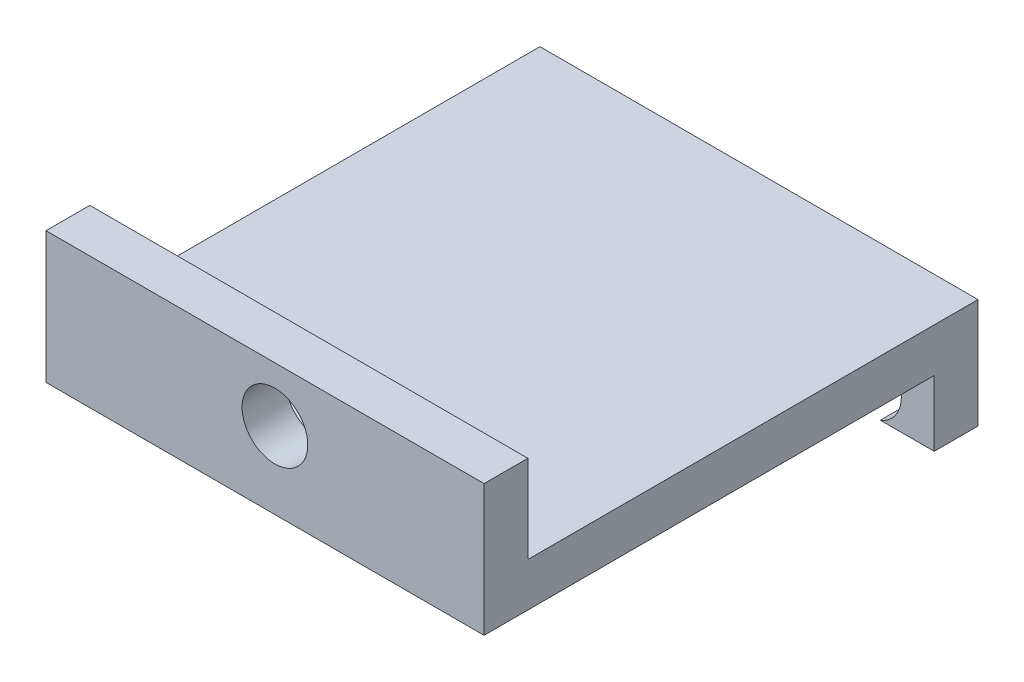
ISO-10303-21;
HEADER;
FILE_DESCRIPTION(('STEP AP214'),'2;1');
FILE_NAME('part.step','',(''),(''),'','','');
FILE_SCHEMA(('AUTOMOTIVE_DESIGN { 1 0 10303 214 1 1 1 1 }'));
ENDSEC;
DATA;
#1=APPLICATION_CONTEXT('core data for automotive mechanical design processes');
#2=APPLICATION_PROTOCOL_DEFINITION('international standard','automotive_design',2000,#1);
#3=PRODUCT_CONTEXT('',#1,'mechanical');
#4=PRODUCT('Part','Part','',(#3));
#5=PRODUCT_RELATED_PRODUCT_CATEGORY('part','',(#4));
#6=PRODUCT_DEFINITION_FORMATION('','',#4);
#7=PRODUCT_DEFINITION_CONTEXT('part definition',#1,'design');
#8=PRODUCT_DEFINITION('design','',#6,#7);
#9=PRODUCT_DEFINITION_SHAPE('','',#8);
#10=(LENGTH_UNIT() NAMED_UNIT(*) SI_UNIT(.MILLI.,.METRE.));
#11=(NAMED_UNIT(*) PLANE_ANGLE_UNIT() SI_UNIT($,.RADIAN.));
#12=(NAMED_UNIT(*) SI_UNIT($,.STERADIAN.) SOLID_ANGLE_UNIT());
#13=UNCERTAINTY_MEASURE_WITH_UNIT(LENGTH_MEASURE(1.E-05),#10,'distance_accuracy_value','');
#14=(GEOMETRIC_REPRESENTATION_CONTEXT(3) GLOBAL_UNCERTAINTY_ASSIGNED_CONTEXT((#13)) GLOBAL_UNIT_ASSIGNED_CONTEXT((#10,
#11,#12)) REPRESENTATION_CONTEXT('',''));
#15=CARTESIAN_POINT('',(0.,0.,0.));
#16=DIRECTION('',(0.,0.,1.));
#17=DIRECTION('',(1.,0.,0.));
#18=AXIS2_PLACEMENT_3D('',#15,#16,#17);
#19=CARTESIAN_POINT('',(6.99999999999999,-1.1,2.));
#20=DIRECTION('',(0.,0.,-1.));
#21=DIRECTION('',(-1.,0.,0.));
#22=AXIS2_PLACEMENT_3D('',#19,#20,#21);
#23=CYLINDRICAL_SURFACE('',#22,1.5);
#24=CARTESIAN_POINT('',(6.99999999999999,-1.1,0.));
#25=DIRECTION('',(0.,0.,1.));
#26=DIRECTION('',(1.,0.,0.));
#27=AXIS2_PLACEMENT_3D('',#24,#25,#26);
#28=CIRCLE('',#27,1.5);
#29=CARTESIAN_POINT('',(7.53851648071344,-2.5,0.));
#30=VERTEX_POINT('',#29);
#31=CARTESIAN_POINT('',(6.46148351928654,-2.5,0.));
#32=VERTEX_POINT('',#31);
#33=EDGE_CURVE('E176',#30,#32,#28,.T.);
#34=ORIENTED_EDGE('',*,*,#33,.F.);
#35=DIRECTION('',(0.,0.,-1.));
#36=VECTOR('',#35,1.);
#37=CARTESIAN_POINT('',(7.53851648071344,-2.5,2.));
#38=LINE('',#37,#36);
#39=CARTESIAN_POINT('',(7.53851648071344,-2.5,2.));
#40=VERTEX_POINT('',#39);
#41=EDGE_CURVE('E11',#40,#30,#38,.T.);
#42=ORIENTED_EDGE('',*,*,#41,.F.);
#43=CARTESIAN_POINT('',(6.99999999999999,-1.1,2.));
#44=DIRECTION('',(0.,0.,1.));
#45=DIRECTION('',(1.,0.,0.));
#46=AXIS2_PLACEMENT_3D('',#43,#44,#45);
#47=CIRCLE('',#46,1.5);
#48=CARTESIAN_POINT('',(6.46148351928654,-2.5,2.));
#49=VERTEX_POINT('',#48);
#50=EDGE_CURVE('E177',#40,#49,#47,.T.);
#51=ORIENTED_EDGE('',*,*,#50,.T.);
#52=DIRECTION('',(0.,0.,-1.));
#53=VECTOR('',#52,1.);
#54=CARTESIAN_POINT('',(6.46148351928654,-2.5,2.));
#55=LINE('',#54,#53);
#56=EDGE_CURVE('E209',#49,#32,#55,.T.);
#57=ORIENTED_EDGE('',*,*,#56,.T.);
#58=EDGE_LOOP('',(#34,#42,#51,#57));
#59=FACE_BOUND('',#58,.T.);
#60=ADVANCED_FACE('F37',(#59),#23,.F.);
#61=CARTESIAN_POINT('',(0.,-2.5,2.));
#62=DIRECTION('',(0.,1.,0.));
#63=DIRECTION('',(0.,0.,1.));
#64=AXIS2_PLACEMENT_3D('',#61,#62,#63);
#65=PLANE('',#64);
#66=DIRECTION('',(1.,0.,0.));
#67=VECTOR('',#66,1.);
#68=CARTESIAN_POINT('',(0.,-2.5,0.));
#69=LINE('',#68,#67);
#70=CARTESIAN_POINT('',(9.99999999999999,-2.5,0.));
#71=VERTEX_POINT('',#70);
#72=EDGE_CURVE('E194',#30,#71,#69,.T.);
#73=ORIENTED_EDGE('',*,*,#72,.T.);
#74=DIRECTION('',(0.,0.,-1.));
#75=VECTOR('',#74,1.);
#76=CARTESIAN_POINT('',(9.99999999999999,-2.5,2.));
#77=LINE('',#76,#75);
#78=CARTESIAN_POINT('',(9.99999999999999,-2.5,2.));
#79=VERTEX_POINT('',#78);
#80=EDGE_CURVE('E45',#79,#71,#77,.T.);
#81=ORIENTED_EDGE('',*,*,#80,.F.);
#82=DIRECTION('',(1.,0.,0.));
#83=VECTOR('',#82,1.);
#84=CARTESIAN_POINT('',(0.,-2.5,2.));
#85=LINE('',#84,#83);
#86=EDGE_CURVE('E180',#40,#79,#85,.T.);
#87=ORIENTED_EDGE('',*,*,#86,.F.);
#88=ORIENTED_EDGE('',*,*,#41,.T.);
#89=EDGE_LOOP('',(#73,#81,#87,#88));
#90=FACE_BOUND('',#89,.T.);
#91=ADVANCED_FACE('F263',(#90),#65,.F.);
#92=CARTESIAN_POINT('',(9.99999999999999,0.,2.));
#93=DIRECTION('',(-1.,0.,0.));
#94=DIRECTION('',(0.,0.,1.));
#95=AXIS2_PLACEMENT_3D('',#92,#93,#94);
#96=PLANE('',#95);
#97=DIRECTION('',(0.,1.,0.));
#98=VECTOR('',#97,1.);
#99=CARTESIAN_POINT('',(9.99999999999999,0.,0.));
#100=LINE('',#99,#98);
#101=CARTESIAN_POINT('',(9.99999999999999,2.5,0.));
#102=VERTEX_POINT('',#101);
#103=EDGE_CURVE('E196',#71,#102,#100,.T.);
#104=ORIENTED_EDGE('',*,*,#103,.T.);
#105=DIRECTION('',(0.,0.,-1.));
#106=VECTOR('',#105,1.);
#107=CARTESIAN_POINT('',(9.99999999999999,2.5,2.));
#108=LINE('',#107,#106);
#109=CARTESIAN_POINT('',(9.99999999999999,2.5,20.55));
#110=VERTEX_POINT('',#109);
#111=EDGE_CURVE('E219',#110,#102,#108,.T.);
#112=ORIENTED_EDGE('',*,*,#111,.F.);
#113=DIRECTION('',(0.,-1.,0.));
#114=VECTOR('',#113,1.);
#115=CARTESIAN_POINT('',(9.99999999999999,6.5,20.55));
#116=LINE('',#115,#114);
#117=CARTESIAN_POINT('',(9.99999999999999,6.5,20.55));
#118=VERTEX_POINT('',#117);
#119=EDGE_CURVE('E165',#118,#110,#116,.T.);
#120=ORIENTED_EDGE('',*,*,#119,.F.);
#121=DIRECTION('',(0.,0.,-1.));
#122=VECTOR('',#121,1.);
#123=CARTESIAN_POINT('',(9.99999999999999,6.5,22.55));
#124=LINE('',#123,#122);
#125=CARTESIAN_POINT('',(9.99999999999999,6.5,22.55));
#126=VERTEX_POINT('',#125);
#127=EDGE_CURVE('E149',#126,#118,#124,.T.);
#128=ORIENTED_EDGE('',*,*,#127,.F.);
#129=DIRECTION('',(0.,1.,0.));
#130=VECTOR('',#129,1.);
#131=CARTESIAN_POINT('',(9.99999999999999,2.5,22.55));
#132=LINE('',#131,#130);
#133=CARTESIAN_POINT('',(9.99999999999999,0.5,22.55));
#134=VERTEX_POINT('',#133);
#135=EDGE_CURVE('E146',#134,#126,#132,.T.);
#136=ORIENTED_EDGE('',*,*,#135,.F.);
#137=DIRECTION('',(0.,0.,-1.));
#138=VECTOR('',#137,1.);
#139=CARTESIAN_POINT('',(9.99999999999999,0.5,22.55));
#140=LINE('',#139,#138);
#141=CARTESIAN_POINT('',(9.99999999999999,0.5,2.));
#142=VERTEX_POINT('',#141);
#143=EDGE_CURVE('E170',#134,#142,#140,.T.);
#144=ORIENTED_EDGE('',*,*,#143,.T.);
#145=DIRECTION('',(0.,1.,0.));
#146=VECTOR('',#145,1.);
#147=CARTESIAN_POINT('',(9.99999999999999,0.,2.));
#148=LINE('',#147,#146);
#149=EDGE_CURVE('E183',#79,#142,#148,.T.);
#150=ORIENTED_EDGE('',*,*,#149,.F.);
#151=ORIENTED_EDGE('',*,*,#80,.T.);
#152=EDGE_LOOP('',(#104,#112,#120,#128,#136,#144,#150,#151));
#153=FACE_BOUND('',#152,.T.);
#154=ADVANCED_FACE('F226',(#153),#96,.F.);
#155=CARTESIAN_POINT('',(0.,2.5,2.));
#156=DIRECTION('',(0.,1.,0.));
#157=DIRECTION('',(0.,0.,1.));
#158=AXIS2_PLACEMENT_3D('',#155,#156,#157);
#159=PLANE('',#158);
#160=DIRECTION('',(-1.,0.,0.));
#161=VECTOR('',#160,1.);
#162=CARTESIAN_POINT('',(-10.,2.5,20.55));
#163=LINE('',#162,#161);
#164=CARTESIAN_POINT('',(0.449999999999992,2.5,20.55));
#165=VERTEX_POINT('',#164);
#166=CARTESIAN_POINT('',(-10.,2.5,20.55));
#167=VERTEX_POINT('',#166);
#168=EDGE_CURVE('E156',#165,#167,#163,.T.);
#169=ORIENTED_EDGE('',*,*,#168,.F.);
#170=EDGE_CURVE('E56',#110,#165,#163,.T.);
#171=ORIENTED_EDGE('',*,*,#170,.F.);
#172=ORIENTED_EDGE('',*,*,#111,.T.);
#173=DIRECTION('',(1.,0.,0.));
#174=VECTOR('',#173,1.);
#175=CARTESIAN_POINT('',(0.,2.5,0.));
#176=LINE('',#175,#174);
#177=CARTESIAN_POINT('',(-10.,2.5,0.));
#178=VERTEX_POINT('',#177);
#179=EDGE_CURVE('E200',#178,#102,#176,.T.);
#180=ORIENTED_EDGE('',*,*,#179,.F.);
#181=DIRECTION('',(0.,0.,-1.));
#182=VECTOR('',#181,1.);
#183=CARTESIAN_POINT('',(-10.,2.5,2.));
#184=LINE('',#183,#182);
#185=EDGE_CURVE('E217',#167,#178,#184,.T.);
#186=ORIENTED_EDGE('',*,*,#185,.F.);
#187=EDGE_LOOP('',(#169,#171,#172,#180,#186));
#188=FACE_BOUND('',#187,.T.);
#189=ADVANCED_FACE('F236',(#188),#159,.T.);
#190=CARTESIAN_POINT('',(-10.,0.,2.));
#191=DIRECTION('',(-1.,0.,0.));
#192=DIRECTION('',(0.,0.,1.));
#193=AXIS2_PLACEMENT_3D('',#190,#191,#192);
#194=PLANE('',#193);
#195=DIRECTION('',(0.,1.,0.));
#196=VECTOR('',#195,1.);
#197=CARTESIAN_POINT('',(-10.,0.,0.));
#198=LINE('',#197,#196);
#199=CARTESIAN_POINT('',(-10.,-2.5,0.));
#200=VERTEX_POINT('',#199);
#201=EDGE_CURVE('E203',#200,#178,#198,.T.);
#202=ORIENTED_EDGE('',*,*,#201,.F.);
#203=DIRECTION('',(0.,0.,-1.));
#204=VECTOR('',#203,1.);
#205=CARTESIAN_POINT('',(-10.,-2.5,2.));
#206=LINE('',#205,#204);
#207=CARTESIAN_POINT('',(-10.,-2.5,2.));
#208=VERTEX_POINT('',#207);
#209=EDGE_CURVE('E215',#208,#200,#206,.T.);
#210=ORIENTED_EDGE('',*,*,#209,.F.);
#211=DIRECTION('',(0.,1.,0.));
#212=VECTOR('',#211,1.);
#213=CARTESIAN_POINT('',(-10.,0.,2.));
#214=LINE('',#213,#212);
#215=CARTESIAN_POINT('',(-10.,0.5,2.));
#216=VERTEX_POINT('',#215);
#217=EDGE_CURVE('E187',#208,#216,#214,.T.);
#218=ORIENTED_EDGE('',*,*,#217,.T.);
#219=DIRECTION('',(0.,0.,-1.));
#220=VECTOR('',#219,1.);
#221=CARTESIAN_POINT('',(-10.,0.5,22.55));
#222=LINE('',#221,#220);
#223=CARTESIAN_POINT('',(-10.,0.5,22.55));
#224=VERTEX_POINT('',#223);
#225=EDGE_CURVE('E137',#224,#216,#222,.T.);
#226=ORIENTED_EDGE('',*,*,#225,.F.);
#227=DIRECTION('',(0.,-1.,0.));
#228=VECTOR('',#227,1.);
#229=CARTESIAN_POINT('',(-10.,2.5,22.55));
#230=LINE('',#229,#228);
#231=CARTESIAN_POINT('',(-10.,6.5,22.55));
#232=VERTEX_POINT('',#231);
#233=EDGE_CURVE('E128',#232,#224,#230,.T.);
#234=ORIENTED_EDGE('',*,*,#233,.F.);
#235=DIRECTION('',(0.,0.,1.));
#236=VECTOR('',#235,1.);
#237=CARTESIAN_POINT('',(-10.,6.5,22.55));
#238=LINE('',#237,#236);
#239=CARTESIAN_POINT('',(-10.,6.5,20.55));
#240=VERTEX_POINT('',#239);
#241=EDGE_CURVE('E134',#240,#232,#238,.T.);
#242=ORIENTED_EDGE('',*,*,#241,.F.);
#243=DIRECTION('',(0.,-1.,0.));
#244=VECTOR('',#243,1.);
#245=CARTESIAN_POINT('',(-10.,6.5,20.55));
#246=LINE('',#245,#244);
#247=EDGE_CURVE('E162',#240,#167,#246,.T.);
#248=ORIENTED_EDGE('',*,*,#247,.T.);
#249=ORIENTED_EDGE('',*,*,#185,.T.);
#250=EDGE_LOOP('',(#202,#210,#218,#226,#234,#242,#248,#249));
#251=FACE_BOUND('',#250,.T.);
#252=ADVANCED_FACE('F131',(#251),#194,.T.);
#253=CARTESIAN_POINT('',(-7.53851648071346,-2.5,0.));
#254=VERTEX_POINT('',#253);
#255=EDGE_CURVE('E197',#200,#254,#69,.T.);
#256=ORIENTED_EDGE('',*,*,#255,.T.);
#257=DIRECTION('',(0.,0.,-1.));
#258=VECTOR('',#257,1.);
#259=CARTESIAN_POINT('',(-7.53851648071346,-2.5,2.));
#260=LINE('',#259,#258);
#261=CARTESIAN_POINT('',(-7.53851648071346,-2.5,2.));
#262=VERTEX_POINT('',#261);
#263=EDGE_CURVE('E213',#262,#254,#260,.T.);
#264=ORIENTED_EDGE('',*,*,#263,.F.);
#265=EDGE_CURVE('E185',#208,#262,#85,.T.);
#266=ORIENTED_EDGE('',*,*,#265,.F.);
#267=ORIENTED_EDGE('',*,*,#209,.T.);
#268=EDGE_LOOP('',(#256,#264,#266,#267));
#269=FACE_BOUND('',#268,.T.);
#270=ADVANCED_FACE('F245',(#269),#65,.F.);
#271=CARTESIAN_POINT('',(-7.00000000000001,-1.1,2.));
#272=DIRECTION('',(0.,0.,-1.));
#273=DIRECTION('',(-1.,0.,0.));
#274=AXIS2_PLACEMENT_3D('',#271,#272,#273);
#275=CYLINDRICAL_SURFACE('',#274,1.5);
#276=CARTESIAN_POINT('',(-7.00000000000001,-1.1,0.));
#277=DIRECTION('',(0.,0.,1.));
#278=DIRECTION('',(1.,0.,0.));
#279=AXIS2_PLACEMENT_3D('',#276,#277,#278);
#280=CIRCLE('',#279,1.5);
#281=CARTESIAN_POINT('',(-6.46148351928656,-2.5,0.));
#282=VERTEX_POINT('',#281);
#283=EDGE_CURVE('E206',#282,#254,#280,.T.);
#284=ORIENTED_EDGE('',*,*,#283,.F.);
#285=DIRECTION('',(0.,0.,-1.));
#286=VECTOR('',#285,1.);
#287=CARTESIAN_POINT('',(-6.46148351928656,-2.5,2.));
#288=LINE('',#287,#286);
#289=CARTESIAN_POINT('',(-6.46148351928656,-2.5,2.));
#290=VERTEX_POINT('',#289);
#291=EDGE_CURVE('E211',#290,#282,#288,.T.);
#292=ORIENTED_EDGE('',*,*,#291,.F.);
#293=CARTESIAN_POINT('',(-7.00000000000001,-1.1,2.));
#294=DIRECTION('',(0.,0.,1.));
#295=DIRECTION('',(1.,0.,0.));
#296=AXIS2_PLACEMENT_3D('',#293,#294,#295);
#297=CIRCLE('',#296,1.5);
#298=EDGE_CURVE('E189',#290,#262,#297,.T.);
#299=ORIENTED_EDGE('',*,*,#298,.T.);
#300=ORIENTED_EDGE('',*,*,#263,.T.);
#301=EDGE_LOOP('',(#284,#292,#299,#300));
#302=FACE_BOUND('',#301,.T.);
#303=ADVANCED_FACE('F276',(#302),#275,.F.);
#304=EDGE_CURVE('E181',#282,#32,#69,.T.);
#305=ORIENTED_EDGE('',*,*,#304,.T.);
#306=ORIENTED_EDGE('',*,*,#56,.F.);
#307=EDGE_CURVE('E184',#290,#49,#85,.T.);
#308=ORIENTED_EDGE('',*,*,#307,.F.);
#309=ORIENTED_EDGE('',*,*,#291,.T.);
#310=EDGE_LOOP('',(#305,#306,#308,#309));
#311=FACE_BOUND('',#310,.T.);
#312=ADVANCED_FACE('F269',(#311),#65,.F.);
#313=CARTESIAN_POINT('',(0.,0.,2.));
#314=DIRECTION('',(0.,0.,1.));
#315=DIRECTION('',(1.,0.,0.));
#316=AXIS2_PLACEMENT_3D('',#313,#314,#315);
#317=PLANE('',#316);
#318=DIRECTION('',(1.,0.,0.));
#319=VECTOR('',#318,1.);
#320=CARTESIAN_POINT('',(-10.,0.5,2.));
#321=LINE('',#320,#319);
#322=EDGE_CURVE('E140',#216,#142,#321,.T.);
#323=ORIENTED_EDGE('',*,*,#322,.F.);
#324=ORIENTED_EDGE('',*,*,#217,.F.);
#325=ORIENTED_EDGE('',*,*,#265,.T.);
#326=ORIENTED_EDGE('',*,*,#298,.F.);
#327=ORIENTED_EDGE('',*,*,#307,.T.);
#328=ORIENTED_EDGE('',*,*,#50,.F.);
#329=ORIENTED_EDGE('',*,*,#86,.T.);
#330=ORIENTED_EDGE('',*,*,#149,.T.);
#331=EDGE_LOOP('',(#323,#324,#325,#326,#327,#328,#329,#330));
#332=FACE_BOUND('',#331,.T.);
#333=ADVANCED_FACE('F248',(#332),#317,.T.);
#334=CARTESIAN_POINT('',(0.,0.,0.));
#335=DIRECTION('',(0.,0.,1.));
#336=DIRECTION('',(1.,0.,0.));
#337=AXIS2_PLACEMENT_3D('',#334,#335,#336);
#338=PLANE('',#337);
#339=ORIENTED_EDGE('',*,*,#33,.T.);
#340=ORIENTED_EDGE('',*,*,#304,.F.);
#341=ORIENTED_EDGE('',*,*,#283,.T.);
#342=ORIENTED_EDGE('',*,*,#255,.F.);
#343=ORIENTED_EDGE('',*,*,#201,.T.);
#344=ORIENTED_EDGE('',*,*,#179,.T.);
#345=ORIENTED_EDGE('',*,*,#103,.F.);
#346=ORIENTED_EDGE('',*,*,#72,.F.);
#347=EDGE_LOOP('',(#339,#340,#341,#342,#343,#344,#345,#346));
#348=FACE_BOUND('',#347,.T.);
#349=ADVANCED_FACE('F231',(#348),#338,.F.);
#350=CARTESIAN_POINT('',(-10.,0.5,22.55));
#351=DIRECTION('',(0.,1.,0.));
#352=DIRECTION('',(0.,0.,1.));
#353=AXIS2_PLACEMENT_3D('',#350,#351,#352);
#354=PLANE('',#353);
#355=ORIENTED_EDGE('',*,*,#322,.T.);
#356=ORIENTED_EDGE('',*,*,#143,.F.);
#357=DIRECTION('',(1.,0.,0.));
#358=VECTOR('',#357,1.);
#359=CARTESIAN_POINT('',(-10.,0.5,22.55));
#360=LINE('',#359,#358);
#361=EDGE_CURVE('E139',#224,#134,#360,.T.);
#362=ORIENTED_EDGE('',*,*,#361,.F.);
#363=ORIENTED_EDGE('',*,*,#225,.T.);
#364=EDGE_LOOP('',(#355,#356,#362,#363));
#365=FACE_BOUND('',#364,.T.);
#366=ADVANCED_FACE('F251',(#365),#354,.F.);
#367=CARTESIAN_POINT('',(0.,0.,22.55));
#368=DIRECTION('',(0.,0.,1.));
#369=DIRECTION('',(1.,0.,0.));
#370=AXIS2_PLACEMENT_3D('',#367,#368,#369);
#371=PLANE('',#370);
#372=CARTESIAN_POINT('',(0.449999999999992,4.,22.55));
#373=DIRECTION('',(0.,0.,1.));
#374=DIRECTION('',(1.,0.,0.));
#375=AXIS2_PLACEMENT_3D('',#372,#373,#374);
#376=CIRCLE('',#375,1.5);
#377=CARTESIAN_POINT('',(1.94999999999999,4.,22.55));
#378=VERTEX_POINT('',#377);
#379=EDGE_CURVE('E159',#378,#378,#376,.T.);
#380=ORIENTED_EDGE('',*,*,#379,.F.);
#381=EDGE_LOOP('',(#380));
#382=FACE_BOUND('',#381,.T.);
#383=ORIENTED_EDGE('',*,*,#233,.T.);
#384=ORIENTED_EDGE('',*,*,#361,.T.);
#385=ORIENTED_EDGE('',*,*,#135,.T.);
#386=DIRECTION('',(1.,0.,0.));
#387=VECTOR('',#386,1.);
#388=CARTESIAN_POINT('',(-10.,6.5,22.55));
#389=LINE('',#388,#387);
#390=EDGE_CURVE('E143',#232,#126,#389,.T.);
#391=ORIENTED_EDGE('',*,*,#390,.F.);
#392=EDGE_LOOP('',(#383,#384,#385,#391));
#393=FACE_BOUND('',#392,.T.);
#394=ADVANCED_FACE('F144',(#382,#393),#371,.T.);
#395=CARTESIAN_POINT('',(-10.,6.5,20.55));
#396=DIRECTION('',(0.,0.,1.));
#397=DIRECTION('',(1.,0.,0.));
#398=AXIS2_PLACEMENT_3D('',#395,#396,#397);
#399=PLANE('',#398);
#400=ORIENTED_EDGE('',*,*,#170,.T.);
#401=CARTESIAN_POINT('',(0.449999999999992,4.,20.55));
#402=DIRECTION('',(0.,0.,1.));
#403=DIRECTION('',(1.,0.,0.));
#404=AXIS2_PLACEMENT_3D('',#401,#402,#403);
#405=CIRCLE('',#404,1.5);
#406=EDGE_CURVE('E40',#165,#165,#405,.T.);
#407=ORIENTED_EDGE('',*,*,#406,.T.);
#408=ORIENTED_EDGE('',*,*,#168,.T.);
#409=ORIENTED_EDGE('',*,*,#247,.F.);
#410=DIRECTION('',(-1.,0.,0.));
#411=VECTOR('',#410,1.);
#412=CARTESIAN_POINT('',(-10.,6.5,20.55));
#413=LINE('',#412,#411);
#414=EDGE_CURVE('E153',#118,#240,#413,.T.);
#415=ORIENTED_EDGE('',*,*,#414,.F.);
#416=ORIENTED_EDGE('',*,*,#119,.T.);
#417=EDGE_LOOP('',(#400,#407,#408,#409,#415,#416));
#418=FACE_BOUND('',#417,.T.);
#419=ADVANCED_FACE('F239',(#418),#399,.F.);
#420=CARTESIAN_POINT('',(0.,6.5,0.));
#421=DIRECTION('',(0.,-1.,0.));
#422=DIRECTION('',(0.,0.,-1.));
#423=AXIS2_PLACEMENT_3D('',#420,#421,#422);
#424=PLANE('',#423);
#425=ORIENTED_EDGE('',*,*,#241,.T.);
#426=ORIENTED_EDGE('',*,*,#390,.T.);
#427=ORIENTED_EDGE('',*,*,#127,.T.);
#428=ORIENTED_EDGE('',*,*,#414,.T.);
#429=EDGE_LOOP('',(#425,#426,#427,#428));
#430=FACE_BOUND('',#429,.T.);
#431=ADVANCED_FACE('F151',(#430),#424,.F.);
#432=CARTESIAN_POINT('',(0.449999999999992,4.,18.55));
#433=DIRECTION('',(0.,0.,1.));
#434=DIRECTION('',(1.,0.,0.));
#435=AXIS2_PLACEMENT_3D('',#432,#433,#434);
#436=CYLINDRICAL_SURFACE('',#435,1.5);
#437=ORIENTED_EDGE('',*,*,#379,.T.);
#438=EDGE_LOOP('',(#437));
#439=FACE_BOUND('',#438,.T.);
#440=ORIENTED_EDGE('',*,*,#406,.F.);
#441=EDGE_LOOP('',(#440));
#442=FACE_BOUND('',#441,.T.);
#443=ADVANCED_FACE('F331',(#439,#442),#436,.F.);
#444=CLOSED_SHELL('',(#60,#91,#154,#189,#252,#270,#303,#312,#333,#349,#366,#394,#419,#431,#443));
#445=MANIFOLD_SOLID_BREP('B2',#444);
#446=ADVANCED_BREP_SHAPE_REPRESENTATION('',(#18,#445),#14);
#447=SHAPE_DEFINITION_REPRESENTATION(#9,#446);
ENDSEC;
END-ISO-10303-21;
